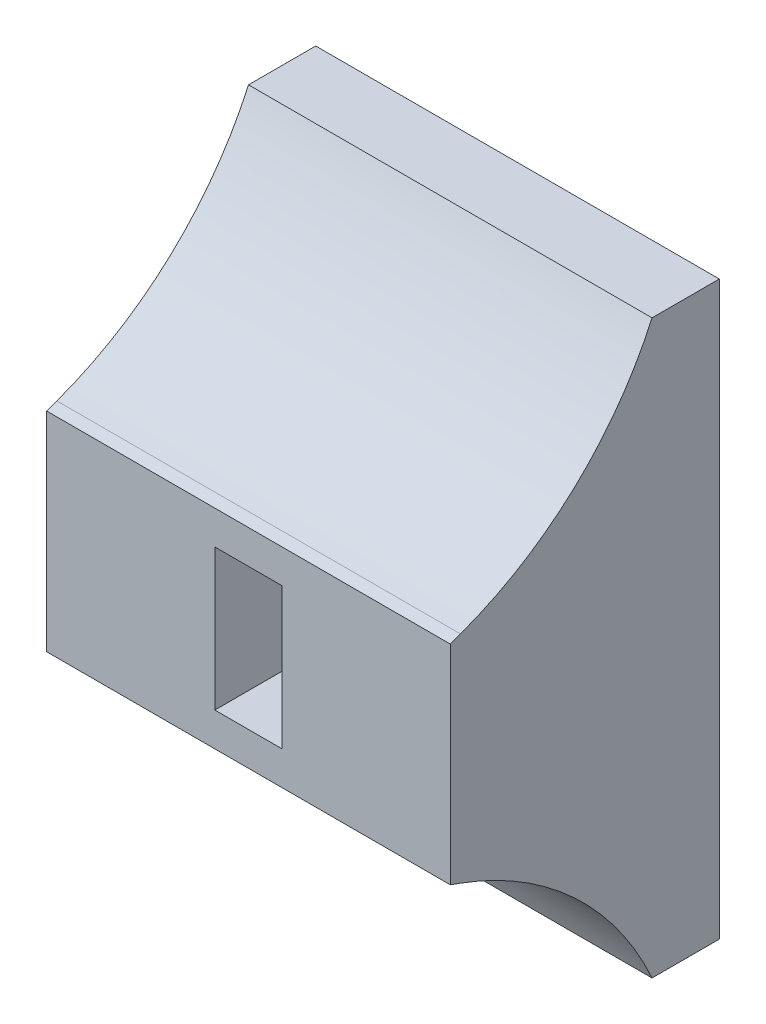
ISO-10303-21;
HEADER;
FILE_DESCRIPTION(('STEP AP214'),'2;1');
FILE_NAME('part.step','',(''),(''),'','','');
FILE_SCHEMA(('AUTOMOTIVE_DESIGN { 1 0 10303 214 1 1 1 1 }'));
ENDSEC;
DATA;
#1=APPLICATION_CONTEXT('core data for automotive mechanical design processes');
#2=APPLICATION_PROTOCOL_DEFINITION('international standard','automotive_design',2000,#1);
#3=PRODUCT_CONTEXT('',#1,'mechanical');
#4=PRODUCT('Part','Part','',(#3));
#5=PRODUCT_RELATED_PRODUCT_CATEGORY('part','',(#4));
#6=PRODUCT_DEFINITION_FORMATION('','',#4);
#7=PRODUCT_DEFINITION_CONTEXT('part definition',#1,'design');
#8=PRODUCT_DEFINITION('design','',#6,#7);
#9=PRODUCT_DEFINITION_SHAPE('','',#8);
#10=(LENGTH_UNIT() NAMED_UNIT(*) SI_UNIT(.MILLI.,.METRE.));
#11=(NAMED_UNIT(*) PLANE_ANGLE_UNIT() SI_UNIT($,.RADIAN.));
#12=(NAMED_UNIT(*) SI_UNIT($,.STERADIAN.) SOLID_ANGLE_UNIT());
#13=UNCERTAINTY_MEASURE_WITH_UNIT(LENGTH_MEASURE(1.E-05),#10,'distance_accuracy_value','');
#14=(GEOMETRIC_REPRESENTATION_CONTEXT(3) GLOBAL_UNCERTAINTY_ASSIGNED_CONTEXT((#13)) GLOBAL_UNIT_ASSIGNED_CONTEXT((#10,
#11,#12)) REPRESENTATION_CONTEXT('',''));
#15=CARTESIAN_POINT('',(0.,0.,0.));
#16=DIRECTION('',(0.,0.,1.));
#17=DIRECTION('',(1.,0.,0.));
#18=AXIS2_PLACEMENT_3D('',#15,#16,#17);
#19=CARTESIAN_POINT('',(0.,0.,8.));
#20=DIRECTION('',(0.,0.,-1.));
#21=DIRECTION('',(-1.,0.,0.));
#22=AXIS2_PLACEMENT_3D('',#19,#20,#21);
#23=PLANE('',#22);
#24=DIRECTION('',(0.,1.,0.));
#25=VECTOR('',#24,1.);
#26=CARTESIAN_POINT('',(1.,-2.1,8.));
#27=LINE('',#26,#25);
#28=CARTESIAN_POINT('',(1.,-2.1,8.));
#29=VERTEX_POINT('',#28);
#30=CARTESIAN_POINT('',(1.,2.1,8.));
#31=VERTEX_POINT('',#30);
#32=EDGE_CURVE('E196',#29,#31,#27,.T.);
#33=ORIENTED_EDGE('',*,*,#32,.F.);
#34=DIRECTION('',(1.,0.,0.));
#35=VECTOR('',#34,1.);
#36=CARTESIAN_POINT('',(-0.999999999999997,-2.1,8.));
#37=LINE('',#36,#35);
#38=CARTESIAN_POINT('',(-0.999999999999997,-2.1,8.));
#39=VERTEX_POINT('',#38);
#40=EDGE_CURVE('E204',#39,#29,#37,.T.);
#41=ORIENTED_EDGE('',*,*,#40,.F.);
#42=DIRECTION('',(0.,-1.,0.));
#43=VECTOR('',#42,1.);
#44=CARTESIAN_POINT('',(-0.999999999999997,-2.1,8.));
#45=LINE('',#44,#43);
#46=CARTESIAN_POINT('',(-0.999999999999997,2.1,8.));
#47=VERTEX_POINT('',#46);
#48=EDGE_CURVE('E201',#47,#39,#45,.T.);
#49=ORIENTED_EDGE('',*,*,#48,.F.);
#50=DIRECTION('',(-1.,0.,0.));
#51=VECTOR('',#50,1.);
#52=CARTESIAN_POINT('',(-0.999999999999997,2.1,8.));
#53=LINE('',#52,#51);
#54=EDGE_CURVE('E198',#31,#47,#53,.T.);
#55=ORIENTED_EDGE('',*,*,#54,.F.);
#56=EDGE_LOOP('',(#33,#41,#49,#55));
#57=FACE_BOUND('',#56,.T.);
#58=DIRECTION('',(-1.,0.,0.));
#59=VECTOR('',#58,1.);
#60=CARTESIAN_POINT('',(6.,-3.1,8.));
#61=LINE('',#60,#59);
#62=CARTESIAN_POINT('',(6.,-3.1,8.));
#63=VERTEX_POINT('',#62);
#64=CARTESIAN_POINT('',(-6.,-3.1,8.));
#65=VERTEX_POINT('',#64);
#66=EDGE_CURVE('E127',#63,#65,#61,.T.);
#67=ORIENTED_EDGE('',*,*,#66,.F.);
#68=DIRECTION('',(0.,1.,0.));
#69=VECTOR('',#68,1.);
#70=CARTESIAN_POINT('',(6.,-8.5,8.));
#71=LINE('',#70,#69);
#72=CARTESIAN_POINT('',(6.,3.1,8.));
#73=VERTEX_POINT('',#72);
#74=EDGE_CURVE('E138',#63,#73,#71,.T.);
#75=ORIENTED_EDGE('',*,*,#74,.T.);
#76=DIRECTION('',(-1.,0.,0.));
#77=VECTOR('',#76,1.);
#78=CARTESIAN_POINT('',(6.,3.1,8.));
#79=LINE('',#78,#77);
#80=CARTESIAN_POINT('',(-6.,3.1,8.));
#81=VERTEX_POINT('',#80);
#82=EDGE_CURVE('E189',#73,#81,#79,.T.);
#83=ORIENTED_EDGE('',*,*,#82,.T.);
#84=DIRECTION('',(0.,-1.,0.));
#85=VECTOR('',#84,1.);
#86=CARTESIAN_POINT('',(-6.,-8.5,8.));
#87=LINE('',#86,#85);
#88=EDGE_CURVE('E141',#81,#65,#87,.T.);
#89=ORIENTED_EDGE('',*,*,#88,.T.);
#90=EDGE_LOOP('',(#67,#75,#83,#89));
#91=FACE_BOUND('',#90,.T.);
#92=ADVANCED_FACE('F35',(#57,#91),#23,.F.);
#93=CARTESIAN_POINT('',(6.,-8.5,8.));
#94=DIRECTION('',(-1.,0.,0.));
#95=DIRECTION('',(0.,0.,1.));
#96=AXIS2_PLACEMENT_3D('',#93,#94,#95);
#97=PLANE('',#96);
#98=DIRECTION('',(0.,0.342020143325673,0.939692620785907));
#99=VECTOR('',#98,1.);
#100=CARTESIAN_POINT('',(6.,-4.79269921233471,3.34934713618183));
#101=LINE('',#100,#99);
#102=CARTESIAN_POINT('',(6.,-3.21010462174369,7.69749003798162));
#103=VERTEX_POINT('',#102);
#104=EDGE_CURVE('E123',#103,#63,#101,.T.);
#105=ORIENTED_EDGE('',*,*,#104,.F.);
#106=CARTESIAN_POINT('',(6.,-12.6070308296028,11.1176914712383));
#107=DIRECTION('',(-1.,0.,0.));
#108=DIRECTION('',(0.,0.,1.));
#109=AXIS2_PLACEMENT_3D('',#106,#107,#108);
#110=CIRCLE('',#109,10.);
#111=CARTESIAN_POINT('',(6.,-8.5,2.));
#112=VERTEX_POINT('',#111);
#113=EDGE_CURVE('E177',#103,#112,#110,.T.);
#114=ORIENTED_EDGE('',*,*,#113,.T.);
#115=DIRECTION('',(0.,0.,-1.));
#116=VECTOR('',#115,1.);
#117=CARTESIAN_POINT('',(6.,-8.5,8.));
#118=LINE('',#117,#116);
#119=CARTESIAN_POINT('',(6.,-8.5,0.));
#120=VERTEX_POINT('',#119);
#121=EDGE_CURVE('E148',#112,#120,#118,.T.);
#122=ORIENTED_EDGE('',*,*,#121,.T.);
#123=DIRECTION('',(0.,1.,0.));
#124=VECTOR('',#123,1.);
#125=CARTESIAN_POINT('',(6.,-8.5,0.));
#126=LINE('',#125,#124);
#127=CARTESIAN_POINT('',(6.,8.5,0.));
#128=VERTEX_POINT('',#127);
#129=EDGE_CURVE('E157',#120,#128,#126,.T.);
#130=ORIENTED_EDGE('',*,*,#129,.T.);
#131=DIRECTION('',(0.,0.,-1.));
#132=VECTOR('',#131,1.);
#133=CARTESIAN_POINT('',(6.,8.5,8.));
#134=LINE('',#133,#132);
#135=CARTESIAN_POINT('',(6.,8.5,2.));
#136=VERTEX_POINT('',#135);
#137=EDGE_CURVE('E170',#136,#128,#134,.T.);
#138=ORIENTED_EDGE('',*,*,#137,.F.);
#139=CARTESIAN_POINT('',(6.,12.6070308296028,11.1176914712383));
#140=DIRECTION('',(-1.,0.,0.));
#141=DIRECTION('',(0.,0.,1.));
#142=AXIS2_PLACEMENT_3D('',#139,#140,#141);
#143=CIRCLE('',#142,10.);
#144=CARTESIAN_POINT('',(6.,3.21010462174369,7.69749003798162));
#145=VERTEX_POINT('',#144);
#146=EDGE_CURVE('E11',#136,#145,#143,.T.);
#147=ORIENTED_EDGE('',*,*,#146,.T.);
#148=DIRECTION('',(0.,-0.342020143325673,0.939692620785907));
#149=VECTOR('',#148,1.);
#150=CARTESIAN_POINT('',(6.,4.79269921233471,3.34934713618183));
#151=LINE('',#150,#149);
#152=EDGE_CURVE('E145',#145,#73,#151,.T.);
#153=ORIENTED_EDGE('',*,*,#152,.T.);
#154=ORIENTED_EDGE('',*,*,#74,.F.);
#155=EDGE_LOOP('',(#105,#114,#122,#130,#138,#147,#153,#154));
#156=FACE_BOUND('',#155,.T.);
#157=ADVANCED_FACE('F144',(#156),#97,.F.);
#158=CARTESIAN_POINT('',(-6.,-8.5,8.));
#159=DIRECTION('',(1.,0.,0.));
#160=DIRECTION('',(0.,0.,-1.));
#161=AXIS2_PLACEMENT_3D('',#158,#159,#160);
#162=PLANE('',#161);
#163=DIRECTION('',(0.,0.,-1.));
#164=VECTOR('',#163,1.);
#165=CARTESIAN_POINT('',(-6.,-8.5,8.));
#166=LINE('',#165,#164);
#167=CARTESIAN_POINT('',(-6.,-8.5,2.));
#168=VERTEX_POINT('',#167);
#169=CARTESIAN_POINT('',(-6.,-8.5,0.));
#170=VERTEX_POINT('',#169);
#171=EDGE_CURVE('E166',#168,#170,#166,.T.);
#172=ORIENTED_EDGE('',*,*,#171,.F.);
#173=CARTESIAN_POINT('',(-6.,-12.6070308296028,11.1176914712383));
#174=DIRECTION('',(1.,0.,0.));
#175=DIRECTION('',(0.,0.,-1.));
#176=AXIS2_PLACEMENT_3D('',#173,#174,#175);
#177=CIRCLE('',#176,10.);
#178=CARTESIAN_POINT('',(-6.,-3.21010462174369,7.69749003798162));
#179=VERTEX_POINT('',#178);
#180=EDGE_CURVE('E175',#168,#179,#177,.T.);
#181=ORIENTED_EDGE('',*,*,#180,.T.);
#182=DIRECTION('',(0.,0.342020143325673,0.939692620785907));
#183=VECTOR('',#182,1.);
#184=CARTESIAN_POINT('',(-6.,-4.79269921233471,3.34934713618183));
#185=LINE('',#184,#183);
#186=EDGE_CURVE('E133',#179,#65,#185,.T.);
#187=ORIENTED_EDGE('',*,*,#186,.T.);
#188=ORIENTED_EDGE('',*,*,#88,.F.);
#189=DIRECTION('',(0.,-0.342020143325673,0.939692620785907));
#190=VECTOR('',#189,1.);
#191=CARTESIAN_POINT('',(-6.,4.79269921233471,3.34934713618183));
#192=LINE('',#191,#190);
#193=CARTESIAN_POINT('',(-6.,3.21010462174369,7.69749003798162));
#194=VERTEX_POINT('',#193);
#195=EDGE_CURVE('E183',#194,#81,#192,.T.);
#196=ORIENTED_EDGE('',*,*,#195,.F.);
#197=CARTESIAN_POINT('',(-6.,12.6070308296028,11.1176914712383));
#198=DIRECTION('',(1.,0.,0.));
#199=DIRECTION('',(0.,0.,-1.));
#200=AXIS2_PLACEMENT_3D('',#197,#198,#199);
#201=CIRCLE('',#200,10.);
#202=CARTESIAN_POINT('',(-6.,8.5,2.));
#203=VERTEX_POINT('',#202);
#204=EDGE_CURVE('E43',#194,#203,#201,.T.);
#205=ORIENTED_EDGE('',*,*,#204,.T.);
#206=DIRECTION('',(0.,0.,-1.));
#207=VECTOR('',#206,1.);
#208=CARTESIAN_POINT('',(-6.,8.5,8.));
#209=LINE('',#208,#207);
#210=CARTESIAN_POINT('',(-6.,8.5,0.));
#211=VERTEX_POINT('',#210);
#212=EDGE_CURVE('E168',#203,#211,#209,.T.);
#213=ORIENTED_EDGE('',*,*,#212,.T.);
#214=DIRECTION('',(0.,-1.,0.));
#215=VECTOR('',#214,1.);
#216=CARTESIAN_POINT('',(-6.,-8.5,0.));
#217=LINE('',#216,#215);
#218=EDGE_CURVE('E151',#211,#170,#217,.T.);
#219=ORIENTED_EDGE('',*,*,#218,.T.);
#220=EDGE_LOOP('',(#172,#181,#187,#188,#196,#205,#213,#219));
#221=FACE_BOUND('',#220,.T.);
#222=ADVANCED_FACE('F182',(#221),#162,.F.);
#223=CARTESIAN_POINT('',(-6.,-8.5,8.));
#224=DIRECTION('',(0.,1.,0.));
#225=DIRECTION('',(0.,0.,1.));
#226=AXIS2_PLACEMENT_3D('',#223,#224,#225);
#227=PLANE('',#226);
#228=DIRECTION('',(-1.,0.,0.));
#229=VECTOR('',#228,1.);
#230=CARTESIAN_POINT('',(6.,-8.5,2.));
#231=LINE('',#230,#229);
#232=EDGE_CURVE('E142',#112,#168,#231,.T.);
#233=ORIENTED_EDGE('',*,*,#232,.T.);
#234=ORIENTED_EDGE('',*,*,#171,.T.);
#235=DIRECTION('',(1.,0.,0.));
#236=VECTOR('',#235,1.);
#237=CARTESIAN_POINT('',(-6.,-8.5,0.));
#238=LINE('',#237,#236);
#239=EDGE_CURVE('E146',#170,#120,#238,.T.);
#240=ORIENTED_EDGE('',*,*,#239,.T.);
#241=ORIENTED_EDGE('',*,*,#121,.F.);
#242=EDGE_LOOP('',(#233,#234,#240,#241));
#243=FACE_BOUND('',#242,.T.);
#244=ADVANCED_FACE('F261',(#243),#227,.F.);
#245=CARTESIAN_POINT('',(0.,0.,0.));
#246=DIRECTION('',(0.,0.,-1.));
#247=DIRECTION('',(-1.,0.,0.));
#248=AXIS2_PLACEMENT_3D('',#245,#246,#247);
#249=PLANE('',#248);
#250=ORIENTED_EDGE('',*,*,#129,.F.);
#251=ORIENTED_EDGE('',*,*,#239,.F.);
#252=ORIENTED_EDGE('',*,*,#218,.F.);
#253=DIRECTION('',(-1.,0.,0.));
#254=VECTOR('',#253,1.);
#255=CARTESIAN_POINT('',(-6.,8.5,0.));
#256=LINE('',#255,#254);
#257=EDGE_CURVE('E160',#128,#211,#256,.T.);
#258=ORIENTED_EDGE('',*,*,#257,.F.);
#259=EDGE_LOOP('',(#250,#251,#252,#258));
#260=FACE_BOUND('',#259,.T.);
#261=DIRECTION('',(1.,0.,0.));
#262=VECTOR('',#261,1.);
#263=CARTESIAN_POINT('',(-0.999999999999997,-2.1,0.));
#264=LINE('',#263,#262);
#265=CARTESIAN_POINT('',(-0.999999999999997,-2.1,0.));
#266=VERTEX_POINT('',#265);
#267=CARTESIAN_POINT('',(1.,-2.1,0.));
#268=VERTEX_POINT('',#267);
#269=EDGE_CURVE('E199',#266,#268,#264,.T.);
#270=ORIENTED_EDGE('',*,*,#269,.T.);
#271=DIRECTION('',(0.,1.,0.));
#272=VECTOR('',#271,1.);
#273=CARTESIAN_POINT('',(1.,-2.1,0.));
#274=LINE('',#273,#272);
#275=CARTESIAN_POINT('',(1.,2.1,0.));
#276=VERTEX_POINT('',#275);
#277=EDGE_CURVE('E191',#268,#276,#274,.T.);
#278=ORIENTED_EDGE('',*,*,#277,.T.);
#279=DIRECTION('',(-1.,0.,0.));
#280=VECTOR('',#279,1.);
#281=CARTESIAN_POINT('',(-0.999999999999997,2.1,0.));
#282=LINE('',#281,#280);
#283=CARTESIAN_POINT('',(-0.999999999999997,2.1,0.));
#284=VERTEX_POINT('',#283);
#285=EDGE_CURVE('E209',#276,#284,#282,.T.);
#286=ORIENTED_EDGE('',*,*,#285,.T.);
#287=DIRECTION('',(0.,-1.,0.));
#288=VECTOR('',#287,1.);
#289=CARTESIAN_POINT('',(-0.999999999999997,-2.1,0.));
#290=LINE('',#289,#288);
#291=EDGE_CURVE('E212',#284,#266,#290,.T.);
#292=ORIENTED_EDGE('',*,*,#291,.T.);
#293=EDGE_LOOP('',(#270,#278,#286,#292));
#294=FACE_BOUND('',#293,.T.);
#295=ADVANCED_FACE('F232',(#260,#294),#249,.T.);
#296=CARTESIAN_POINT('',(-6.,8.5,8.));
#297=DIRECTION('',(0.,-1.,0.));
#298=DIRECTION('',(0.,0.,-1.));
#299=AXIS2_PLACEMENT_3D('',#296,#297,#298);
#300=PLANE('',#299);
#301=ORIENTED_EDGE('',*,*,#212,.F.);
#302=DIRECTION('',(-1.,0.,0.));
#303=VECTOR('',#302,1.);
#304=CARTESIAN_POINT('',(6.,8.5,2.));
#305=LINE('',#304,#303);
#306=EDGE_CURVE('E186',#136,#203,#305,.T.);
#307=ORIENTED_EDGE('',*,*,#306,.F.);
#308=ORIENTED_EDGE('',*,*,#137,.T.);
#309=ORIENTED_EDGE('',*,*,#257,.T.);
#310=EDGE_LOOP('',(#301,#307,#308,#309));
#311=FACE_BOUND('',#310,.T.);
#312=ADVANCED_FACE('F185',(#311),#300,.F.);
#313=CARTESIAN_POINT('',(1.,-2.1,8.));
#314=DIRECTION('',(-1.,0.,0.));
#315=DIRECTION('',(0.,0.,1.));
#316=AXIS2_PLACEMENT_3D('',#313,#314,#315);
#317=PLANE('',#316);
#318=ORIENTED_EDGE('',*,*,#277,.F.);
#319=DIRECTION('',(0.,0.,-1.));
#320=VECTOR('',#319,1.);
#321=CARTESIAN_POINT('',(1.,-2.1,8.));
#322=LINE('',#321,#320);
#323=EDGE_CURVE('E206',#29,#268,#322,.T.);
#324=ORIENTED_EDGE('',*,*,#323,.F.);
#325=ORIENTED_EDGE('',*,*,#32,.T.);
#326=DIRECTION('',(0.,0.,-1.));
#327=VECTOR('',#326,1.);
#328=CARTESIAN_POINT('',(1.,2.1,8.));
#329=LINE('',#328,#327);
#330=EDGE_CURVE('E154',#31,#276,#329,.T.);
#331=ORIENTED_EDGE('',*,*,#330,.T.);
#332=EDGE_LOOP('',(#318,#324,#325,#331));
#333=FACE_BOUND('',#332,.T.);
#334=ADVANCED_FACE('F227',(#333),#317,.T.);
#335=CARTESIAN_POINT('',(-0.999999999999997,2.1,8.));
#336=DIRECTION('',(0.,-1.,0.));
#337=DIRECTION('',(0.,0.,-1.));
#338=AXIS2_PLACEMENT_3D('',#335,#336,#337);
#339=PLANE('',#338);
#340=ORIENTED_EDGE('',*,*,#285,.F.);
#341=ORIENTED_EDGE('',*,*,#330,.F.);
#342=ORIENTED_EDGE('',*,*,#54,.T.);
#343=DIRECTION('',(0.,0.,-1.));
#344=VECTOR('',#343,1.);
#345=CARTESIAN_POINT('',(-0.999999999999997,2.1,8.));
#346=LINE('',#345,#344);
#347=EDGE_CURVE('E220',#47,#284,#346,.T.);
#348=ORIENTED_EDGE('',*,*,#347,.T.);
#349=EDGE_LOOP('',(#340,#341,#342,#348));
#350=FACE_BOUND('',#349,.T.);
#351=ADVANCED_FACE('F239',(#350),#339,.T.);
#352=CARTESIAN_POINT('',(-0.999999999999997,-2.1,8.));
#353=DIRECTION('',(1.,0.,0.));
#354=DIRECTION('',(0.,0.,-1.));
#355=AXIS2_PLACEMENT_3D('',#352,#353,#354);
#356=PLANE('',#355);
#357=ORIENTED_EDGE('',*,*,#291,.F.);
#358=ORIENTED_EDGE('',*,*,#347,.F.);
#359=ORIENTED_EDGE('',*,*,#48,.T.);
#360=DIRECTION('',(0.,0.,-1.));
#361=VECTOR('',#360,1.);
#362=CARTESIAN_POINT('',(-0.999999999999997,-2.1,8.));
#363=LINE('',#362,#361);
#364=EDGE_CURVE('E219',#39,#266,#363,.T.);
#365=ORIENTED_EDGE('',*,*,#364,.T.);
#366=EDGE_LOOP('',(#357,#358,#359,#365));
#367=FACE_BOUND('',#366,.T.);
#368=ADVANCED_FACE('F241',(#367),#356,.T.);
#369=CARTESIAN_POINT('',(-0.999999999999997,-2.1,8.));
#370=DIRECTION('',(0.,1.,0.));
#371=DIRECTION('',(0.,0.,1.));
#372=AXIS2_PLACEMENT_3D('',#369,#370,#371);
#373=PLANE('',#372);
#374=ORIENTED_EDGE('',*,*,#269,.F.);
#375=ORIENTED_EDGE('',*,*,#364,.F.);
#376=ORIENTED_EDGE('',*,*,#40,.T.);
#377=ORIENTED_EDGE('',*,*,#323,.T.);
#378=EDGE_LOOP('',(#374,#375,#376,#377));
#379=FACE_BOUND('',#378,.T.);
#380=ADVANCED_FACE('F235',(#379),#373,.T.);
#381=CARTESIAN_POINT('',(6.,4.79269921233471,3.34934713618183));
#382=DIRECTION('',(0.,-0.939692620785907,-0.342020143325673));
#383=DIRECTION('',(0.,0.342020143325673,-0.939692620785907));
#384=AXIS2_PLACEMENT_3D('',#381,#382,#383);
#385=PLANE('',#384);
#386=ORIENTED_EDGE('',*,*,#152,.F.);
#387=DIRECTION('',(-1.,0.,0.));
#388=VECTOR('',#387,1.);
#389=CARTESIAN_POINT('',(6.,3.21010462174369,7.69749003798162));
#390=LINE('',#389,#388);
#391=EDGE_CURVE('E173',#145,#194,#390,.T.);
#392=ORIENTED_EDGE('',*,*,#391,.T.);
#393=ORIENTED_EDGE('',*,*,#195,.T.);
#394=ORIENTED_EDGE('',*,*,#82,.F.);
#395=EDGE_LOOP('',(#386,#392,#393,#394));
#396=FACE_BOUND('',#395,.T.);
#397=ADVANCED_FACE('F248',(#396),#385,.F.);
#398=CARTESIAN_POINT('',(6.,-4.79269921233471,3.34934713618183));
#399=DIRECTION('',(0.,-0.939692620785907,0.342020143325673));
#400=DIRECTION('',(0.,-0.342020143325673,-0.939692620785907));
#401=AXIS2_PLACEMENT_3D('',#398,#399,#400);
#402=PLANE('',#401);
#403=ORIENTED_EDGE('',*,*,#186,.F.);
#404=DIRECTION('',(1.,0.,0.));
#405=VECTOR('',#404,1.);
#406=CARTESIAN_POINT('',(6.,-3.21010462174369,7.69749003798162));
#407=LINE('',#406,#405);
#408=EDGE_CURVE('E130',#179,#103,#407,.T.);
#409=ORIENTED_EDGE('',*,*,#408,.T.);
#410=ORIENTED_EDGE('',*,*,#104,.T.);
#411=ORIENTED_EDGE('',*,*,#66,.T.);
#412=EDGE_LOOP('',(#403,#409,#410,#411));
#413=FACE_BOUND('',#412,.T.);
#414=ADVANCED_FACE('F126',(#413),#402,.T.);
#415=CARTESIAN_POINT('',(6.,-12.6070308296028,11.1176914712383));
#416=DIRECTION('',(-1.,0.,0.));
#417=DIRECTION('',(0.,0.,1.));
#418=AXIS2_PLACEMENT_3D('',#415,#416,#417);
#419=CYLINDRICAL_SURFACE('',#418,10.);
#420=ORIENTED_EDGE('',*,*,#113,.F.);
#421=ORIENTED_EDGE('',*,*,#408,.F.);
#422=ORIENTED_EDGE('',*,*,#180,.F.);
#423=ORIENTED_EDGE('',*,*,#232,.F.);
#424=EDGE_LOOP('',(#420,#421,#422,#423));
#425=FACE_BOUND('',#424,.T.);
#426=ADVANCED_FACE('F269',(#425),#419,.F.);
#427=CARTESIAN_POINT('',(6.,12.6070308296028,11.1176914712383));
#428=DIRECTION('',(-1.,0.,0.));
#429=DIRECTION('',(0.,0.,1.));
#430=AXIS2_PLACEMENT_3D('',#427,#428,#429);
#431=CYLINDRICAL_SURFACE('',#430,10.);
#432=ORIENTED_EDGE('',*,*,#146,.F.);
#433=ORIENTED_EDGE('',*,*,#306,.T.);
#434=ORIENTED_EDGE('',*,*,#204,.F.);
#435=ORIENTED_EDGE('',*,*,#391,.F.);
#436=EDGE_LOOP('',(#432,#433,#434,#435));
#437=FACE_BOUND('',#436,.T.);
#438=ADVANCED_FACE('F37',(#437),#431,.F.);
#439=CLOSED_SHELL('',(#92,#157,#222,#244,#295,#312,#334,#351,#368,#380,#397,#414,#426,#438));
#440=MANIFOLD_SOLID_BREP('B2',#439);
#441=ADVANCED_BREP_SHAPE_REPRESENTATION('',(#18,#440),#14);
#442=SHAPE_DEFINITION_REPRESENTATION(#9,#441);
ENDSEC;
END-ISO-10303-21;
